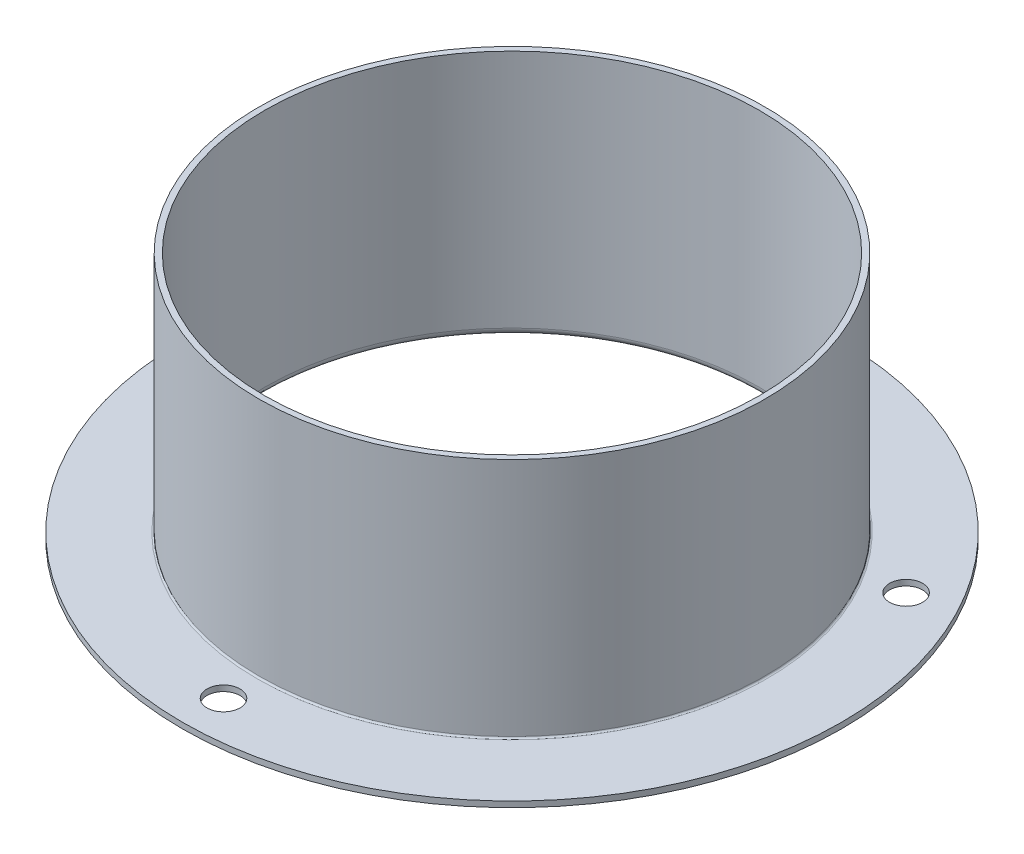
ISO-10303-21;
HEADER;
FILE_DESCRIPTION(('STEP AP214'),'2;1');
FILE_NAME('part.step','',(''),(''),'','','');
FILE_SCHEMA(('AUTOMOTIVE_DESIGN { 1 0 10303 214 1 1 1 1 }'));
ENDSEC;
DATA;
#1=APPLICATION_CONTEXT('core data for automotive mechanical design processes');
#2=APPLICATION_PROTOCOL_DEFINITION('international standard','automotive_design',2000,#1);
#3=PRODUCT_CONTEXT('',#1,'mechanical');
#4=PRODUCT('Part','Part','',(#3));
#5=PRODUCT_RELATED_PRODUCT_CATEGORY('part','',(#4));
#6=PRODUCT_DEFINITION_FORMATION('','',#4);
#7=PRODUCT_DEFINITION_CONTEXT('part definition',#1,'design');
#8=PRODUCT_DEFINITION('design','',#6,#7);
#9=PRODUCT_DEFINITION_SHAPE('','',#8);
#10=(LENGTH_UNIT() NAMED_UNIT(*) SI_UNIT(.MILLI.,.METRE.));
#11=(NAMED_UNIT(*) PLANE_ANGLE_UNIT() SI_UNIT($,.RADIAN.));
#12=(NAMED_UNIT(*) SI_UNIT($,.STERADIAN.) SOLID_ANGLE_UNIT());
#13=UNCERTAINTY_MEASURE_WITH_UNIT(LENGTH_MEASURE(1.E-05),#10,'distance_accuracy_value','');
#14=(GEOMETRIC_REPRESENTATION_CONTEXT(3) GLOBAL_UNCERTAINTY_ASSIGNED_CONTEXT((#13)) GLOBAL_UNIT_ASSIGNED_CONTEXT((#10,
#11,#12)) REPRESENTATION_CONTEXT('',''));
#15=CARTESIAN_POINT('',(0.,0.,0.));
#16=DIRECTION('',(0.,0.,1.));
#17=DIRECTION('',(1.,0.,0.));
#18=AXIS2_PLACEMENT_3D('',#15,#16,#17);
#19=CARTESIAN_POINT('',(0.,-0.7,0.));
#20=DIRECTION('',(0.,1.,0.));
#21=DIRECTION('',(0.,0.,1.));
#22=AXIS2_PLACEMENT_3D('',#19,#20,#21);
#23=CYLINDRICAL_SURFACE('',#22,40.);
#24=CARTESIAN_POINT('',(0.,-0.7,0.));
#25=DIRECTION('',(0.,1.,0.));
#26=DIRECTION('',(0.,0.,1.));
#27=AXIS2_PLACEMENT_3D('',#24,#25,#26);
#28=CIRCLE('',#27,40.);
#29=CARTESIAN_POINT('',(0.,-0.7,40.));
#30=VERTEX_POINT('',#29);
#31=EDGE_CURVE('E100',#30,#30,#28,.T.);
#32=ORIENTED_EDGE('',*,*,#31,.T.);
#33=EDGE_LOOP('',(#32));
#34=FACE_BOUND('',#33,.T.);
#35=CARTESIAN_POINT('',(0.,0.,0.));
#36=DIRECTION('',(0.,1.,0.));
#37=DIRECTION('',(0.,0.,1.));
#38=AXIS2_PLACEMENT_3D('',#35,#36,#37);
#39=CIRCLE('',#38,40.);
#40=CARTESIAN_POINT('',(0.,0.,40.));
#41=VERTEX_POINT('',#40);
#42=EDGE_CURVE('E171',#41,#41,#39,.T.);
#43=ORIENTED_EDGE('',*,*,#42,.F.);
#44=EDGE_LOOP('',(#43));
#45=FACE_BOUND('',#44,.T.);
#46=ADVANCED_FACE('F92',(#34,#45),#23,.T.);
#47=CARTESIAN_POINT('',(0.,-0.7,0.));
#48=DIRECTION('',(0.,1.,0.));
#49=DIRECTION('',(0.,0.,1.));
#50=AXIS2_PLACEMENT_3D('',#47,#48,#49);
#51=PLANE('',#50);
#52=CARTESIAN_POINT('',(0.,-0.7,0.));
#53=DIRECTION('',(0.,1.,0.));
#54=DIRECTION('',(0.,0.,1.));
#55=AXIS2_PLACEMENT_3D('',#52,#53,#54);
#56=CIRCLE('',#55,30.9);
#57=CARTESIAN_POINT('',(0.,-0.7,30.9));
#58=VERTEX_POINT('',#57);
#59=EDGE_CURVE('E233',#58,#58,#56,.T.);
#60=ORIENTED_EDGE('',*,*,#59,.T.);
#61=EDGE_LOOP('',(#60));
#62=FACE_BOUND('',#61,.T.);
#63=CARTESIAN_POINT('',(30.3108891324554,-0.7,-17.5));
#64=DIRECTION('',(0.,1.,0.));
#65=DIRECTION('',(0.,0.,1.));
#66=AXIS2_PLACEMENT_3D('',#63,#64,#65);
#67=CIRCLE('',#66,2.);
#68=CARTESIAN_POINT('',(30.3108891324554,-0.7,-15.5));
#69=VERTEX_POINT('',#68);
#70=EDGE_CURVE('E151',#69,#69,#67,.T.);
#71=ORIENTED_EDGE('',*,*,#70,.T.);
#72=EDGE_LOOP('',(#71));
#73=FACE_BOUND('',#72,.T.);
#74=CARTESIAN_POINT('',(0.,-0.7,35.));
#75=DIRECTION('',(0.,1.,0.));
#76=DIRECTION('',(0.,0.,1.));
#77=AXIS2_PLACEMENT_3D('',#74,#75,#76);
#78=CIRCLE('',#77,2.);
#79=CARTESIAN_POINT('',(0.,-0.7,37.));
#80=VERTEX_POINT('',#79);
#81=EDGE_CURVE('E159',#80,#80,#78,.T.);
#82=ORIENTED_EDGE('',*,*,#81,.T.);
#83=EDGE_LOOP('',(#82));
#84=FACE_BOUND('',#83,.T.);
#85=CARTESIAN_POINT('',(-30.3108891324554,-0.7,-17.5));
#86=DIRECTION('',(0.,1.,0.));
#87=DIRECTION('',(0.,0.,1.));
#88=AXIS2_PLACEMENT_3D('',#85,#86,#87);
#89=CIRCLE('',#88,2.);
#90=CARTESIAN_POINT('',(-30.3108891324554,-0.7,-15.5));
#91=VERTEX_POINT('',#90);
#92=EDGE_CURVE('E167',#91,#91,#89,.T.);
#93=ORIENTED_EDGE('',*,*,#92,.T.);
#94=EDGE_LOOP('',(#93));
#95=FACE_BOUND('',#94,.T.);
#96=ORIENTED_EDGE('',*,*,#31,.F.);
#97=EDGE_LOOP('',(#96));
#98=FACE_BOUND('',#97,.T.);
#99=ADVANCED_FACE('F184',(#62,#73,#84,#95,#98),#51,.F.);
#100=CARTESIAN_POINT('',(0.,0.,0.));
#101=DIRECTION('',(0.,1.,0.));
#102=DIRECTION('',(0.,0.,1.));
#103=AXIS2_PLACEMENT_3D('',#100,#101,#102);
#104=PLANE('',#103);
#105=CARTESIAN_POINT('',(0.,0.,0.));
#106=DIRECTION('',(0.,1.,0.));
#107=DIRECTION('',(0.,0.,1.));
#108=AXIS2_PLACEMENT_3D('',#105,#106,#107);
#109=CIRCLE('',#108,30.9);
#110=CARTESIAN_POINT('',(0.,0.,30.9));
#111=VERTEX_POINT('',#110);
#112=EDGE_CURVE('E12',#111,#111,#109,.T.);
#113=ORIENTED_EDGE('',*,*,#112,.F.);
#114=EDGE_LOOP('',(#113));
#115=FACE_BOUND('',#114,.T.);
#116=CARTESIAN_POINT('',(30.3108891324554,0.,-17.5));
#117=DIRECTION('',(0.,1.,0.));
#118=DIRECTION('',(0.,0.,1.));
#119=AXIS2_PLACEMENT_3D('',#116,#117,#118);
#120=CIRCLE('',#119,2.);
#121=CARTESIAN_POINT('',(30.3108891324554,0.,-15.5));
#122=VERTEX_POINT('',#121);
#123=EDGE_CURVE('E132',#122,#122,#120,.T.);
#124=ORIENTED_EDGE('',*,*,#123,.F.);
#125=EDGE_LOOP('',(#124));
#126=FACE_BOUND('',#125,.T.);
#127=CARTESIAN_POINT('',(0.,0.,35.));
#128=DIRECTION('',(0.,1.,0.));
#129=DIRECTION('',(0.,0.,1.));
#130=AXIS2_PLACEMENT_3D('',#127,#128,#129);
#131=CIRCLE('',#130,2.);
#132=CARTESIAN_POINT('',(0.,0.,37.));
#133=VERTEX_POINT('',#132);
#134=EDGE_CURVE('E155',#133,#133,#131,.T.);
#135=ORIENTED_EDGE('',*,*,#134,.F.);
#136=EDGE_LOOP('',(#135));
#137=FACE_BOUND('',#136,.T.);
#138=CARTESIAN_POINT('',(-30.3108891324554,0.,-17.5));
#139=DIRECTION('',(0.,1.,0.));
#140=DIRECTION('',(0.,0.,1.));
#141=AXIS2_PLACEMENT_3D('',#138,#139,#140);
#142=CIRCLE('',#141,2.);
#143=CARTESIAN_POINT('',(-30.3108891324554,0.,-15.5));
#144=VERTEX_POINT('',#143);
#145=EDGE_CURVE('E163',#144,#144,#142,.T.);
#146=ORIENTED_EDGE('',*,*,#145,.F.);
#147=EDGE_LOOP('',(#146));
#148=FACE_BOUND('',#147,.T.);
#149=ORIENTED_EDGE('',*,*,#42,.T.);
#150=EDGE_LOOP('',(#149));
#151=FACE_BOUND('',#150,.T.);
#152=ADVANCED_FACE('F181',(#115,#126,#137,#148,#151),#104,.T.);
#153=CARTESIAN_POINT('',(-30.3108891324554,-0.7,-17.5));
#154=DIRECTION('',(0.,1.,0.));
#155=DIRECTION('',(0.,0.,1.));
#156=AXIS2_PLACEMENT_3D('',#153,#154,#155);
#157=CYLINDRICAL_SURFACE('',#156,2.);
#158=ORIENTED_EDGE('',*,*,#92,.F.);
#159=EDGE_LOOP('',(#158));
#160=FACE_BOUND('',#159,.T.);
#161=ORIENTED_EDGE('',*,*,#145,.T.);
#162=EDGE_LOOP('',(#161));
#163=FACE_BOUND('',#162,.T.);
#164=ADVANCED_FACE('F196',(#160,#163),#157,.F.);
#165=CARTESIAN_POINT('',(0.,-0.7,35.));
#166=DIRECTION('',(0.,1.,0.));
#167=DIRECTION('',(0.,0.,1.));
#168=AXIS2_PLACEMENT_3D('',#165,#166,#167);
#169=CYLINDRICAL_SURFACE('',#168,2.);
#170=ORIENTED_EDGE('',*,*,#81,.F.);
#171=EDGE_LOOP('',(#170));
#172=FACE_BOUND('',#171,.T.);
#173=ORIENTED_EDGE('',*,*,#134,.T.);
#174=EDGE_LOOP('',(#173));
#175=FACE_BOUND('',#174,.T.);
#176=ADVANCED_FACE('F203',(#172,#175),#169,.F.);
#177=CARTESIAN_POINT('',(30.3108891324554,-0.7,-17.5));
#178=DIRECTION('',(0.,1.,0.));
#179=DIRECTION('',(0.,0.,1.));
#180=AXIS2_PLACEMENT_3D('',#177,#178,#179);
#181=CYLINDRICAL_SURFACE('',#180,2.);
#182=ORIENTED_EDGE('',*,*,#70,.F.);
#183=EDGE_LOOP('',(#182));
#184=FACE_BOUND('',#183,.T.);
#185=ORIENTED_EDGE('',*,*,#123,.T.);
#186=EDGE_LOOP('',(#185));
#187=FACE_BOUND('',#186,.T.);
#188=ADVANCED_FACE('F207',(#184,#187),#181,.F.);
#189=CARTESIAN_POINT('',(0.,29.3,0.));
#190=DIRECTION('',(0.,-1.,0.));
#191=DIRECTION('',(0.,0.,-1.));
#192=AXIS2_PLACEMENT_3D('',#189,#190,#191);
#193=PLANE('',#192);
#194=CARTESIAN_POINT('',(0.,29.3,0.));
#195=DIRECTION('',(0.,1.,0.));
#196=DIRECTION('',(0.,0.,1.));
#197=AXIS2_PLACEMENT_3D('',#194,#195,#196);
#198=CIRCLE('',#197,30.7000000000001);
#199=CARTESIAN_POINT('',(0.,29.3,30.7000000000001));
#200=VERTEX_POINT('',#199);
#201=EDGE_CURVE('E128',#200,#200,#198,.T.);
#202=ORIENTED_EDGE('',*,*,#201,.T.);
#203=EDGE_LOOP('',(#202));
#204=FACE_BOUND('',#203,.T.);
#205=CARTESIAN_POINT('',(0.,29.3,0.));
#206=DIRECTION('',(0.,1.,0.));
#207=DIRECTION('',(0.,0.,1.));
#208=AXIS2_PLACEMENT_3D('',#205,#206,#207);
#209=CIRCLE('',#208,30.);
#210=CARTESIAN_POINT('',(0.,29.3,30.));
#211=VERTEX_POINT('',#210);
#212=EDGE_CURVE('E129',#211,#211,#209,.T.);
#213=ORIENTED_EDGE('',*,*,#212,.F.);
#214=EDGE_LOOP('',(#213));
#215=FACE_BOUND('',#214,.T.);
#216=ADVANCED_FACE('F126',(#204,#215),#193,.F.);
#217=CARTESIAN_POINT('',(0.,0.,0.));
#218=DIRECTION('',(0.,1.,0.));
#219=DIRECTION('',(0.,0.,1.));
#220=AXIS2_PLACEMENT_3D('',#217,#218,#219);
#221=CYLINDRICAL_SURFACE('',#220,30.);
#222=DIRECTION('',(0.,1.,0.));
#223=VECTOR('',#222,1.);
#224=CARTESIAN_POINT('',(0.,0.,30.));
#225=LINE('',#224,#223);
#226=CARTESIAN_POINT('',(0.,0.200000000000003,30.));
#227=VERTEX_POINT('',#226);
#228=EDGE_CURVE('E230',#227,#211,#225,.T.);
#229=ORIENTED_EDGE('',*,*,#228,.F.);
#230=CARTESIAN_POINT('',(0.,0.200000000000003,0.));
#231=DIRECTION('',(0.,1.,0.));
#232=DIRECTION('',(0.,0.,1.));
#233=AXIS2_PLACEMENT_3D('',#230,#231,#232);
#234=CIRCLE('',#233,30.);
#235=EDGE_CURVE('E231',#227,#227,#234,.T.);
#236=ORIENTED_EDGE('',*,*,#235,.F.);
#237=ORIENTED_EDGE('',*,*,#228,.T.);
#238=ORIENTED_EDGE('',*,*,#212,.T.);
#239=EDGE_LOOP('',(#229,#236,#237,#238));
#240=FACE_BOUND('',#239,.T.);
#241=ADVANCED_FACE('F214',(#240),#221,.F.);
#242=CARTESIAN_POINT('',(0.,0.2,0.));
#243=DIRECTION('',(0.,1.,0.));
#244=DIRECTION('',(0.,0.,1.));
#245=AXIS2_PLACEMENT_3D('',#242,#243,#244);
#246=TOROIDAL_SURFACE('',#245,30.9,0.9);
#247=CARTESIAN_POINT('',(0.,0.2,30.9));
#248=DIRECTION('',(-1.,0.,0.));
#249=DIRECTION('',(0.,0.,1.));
#250=AXIS2_PLACEMENT_3D('',#247,#248,#249);
#251=CIRCLE('',#250,0.9);
#252=EDGE_CURVE('E107',#58,#227,#251,.F.);
#253=ORIENTED_EDGE('',*,*,#252,.F.);
#254=ORIENTED_EDGE('',*,*,#59,.F.);
#255=ORIENTED_EDGE('',*,*,#252,.T.);
#256=ORIENTED_EDGE('',*,*,#235,.T.);
#257=EDGE_LOOP('',(#253,#254,#255,#256));
#258=FACE_BOUND('',#257,.T.);
#259=ADVANCED_FACE('F218',(#258),#246,.T.);
#260=CARTESIAN_POINT('',(0.,0.,0.));
#261=DIRECTION('',(0.,1.,0.));
#262=DIRECTION('',(0.,0.,1.));
#263=AXIS2_PLACEMENT_3D('',#260,#261,#262);
#264=CYLINDRICAL_SURFACE('',#263,30.7);
#265=DIRECTION('',(0.,1.,0.));
#266=VECTOR('',#265,1.);
#267=CARTESIAN_POINT('',(0.,0.,30.7));
#268=LINE('',#267,#266);
#269=CARTESIAN_POINT('',(0.,0.200000000000001,30.7));
#270=VERTEX_POINT('',#269);
#271=EDGE_CURVE('E137',#270,#200,#268,.T.);
#272=ORIENTED_EDGE('',*,*,#271,.T.);
#273=ORIENTED_EDGE('',*,*,#201,.F.);
#274=ORIENTED_EDGE('',*,*,#271,.F.);
#275=CARTESIAN_POINT('',(0.,0.200000000000001,0.));
#276=DIRECTION('',(0.,1.,0.));
#277=DIRECTION('',(0.,0.,1.));
#278=AXIS2_PLACEMENT_3D('',#275,#276,#277);
#279=CIRCLE('',#278,30.7);
#280=EDGE_CURVE('E140',#270,#270,#279,.T.);
#281=ORIENTED_EDGE('',*,*,#280,.T.);
#282=EDGE_LOOP('',(#272,#273,#274,#281));
#283=FACE_BOUND('',#282,.T.);
#284=ADVANCED_FACE('F138',(#283),#264,.T.);
#285=CARTESIAN_POINT('',(0.,0.2,0.));
#286=DIRECTION('',(0.,1.,0.));
#287=DIRECTION('',(0.,0.,1.));
#288=AXIS2_PLACEMENT_3D('',#285,#286,#287);
#289=TOROIDAL_SURFACE('',#288,30.9,0.2);
#290=CARTESIAN_POINT('',(0.,0.2,30.9));
#291=DIRECTION('',(-1.,0.,0.));
#292=DIRECTION('',(0.,0.,1.));
#293=AXIS2_PLACEMENT_3D('',#290,#291,#292);
#294=CIRCLE('',#293,0.2);
#295=EDGE_CURVE('E142',#111,#270,#294,.F.);
#296=ORIENTED_EDGE('',*,*,#295,.T.);
#297=ORIENTED_EDGE('',*,*,#280,.F.);
#298=ORIENTED_EDGE('',*,*,#295,.F.);
#299=ORIENTED_EDGE('',*,*,#112,.T.);
#300=EDGE_LOOP('',(#296,#297,#298,#299));
#301=FACE_BOUND('',#300,.T.);
#302=ADVANCED_FACE('F217',(#301),#289,.F.);
#303=CLOSED_SHELL('',(#46,#99,#152,#164,#176,#188,#216,#241,#259,#284,#302));
#304=MANIFOLD_SOLID_BREP('B2',#303);
#305=ADVANCED_BREP_SHAPE_REPRESENTATION('',(#18,#304),#14);
#306=SHAPE_DEFINITION_REPRESENTATION(#9,#305);
ENDSEC;
END-ISO-10303-21;
